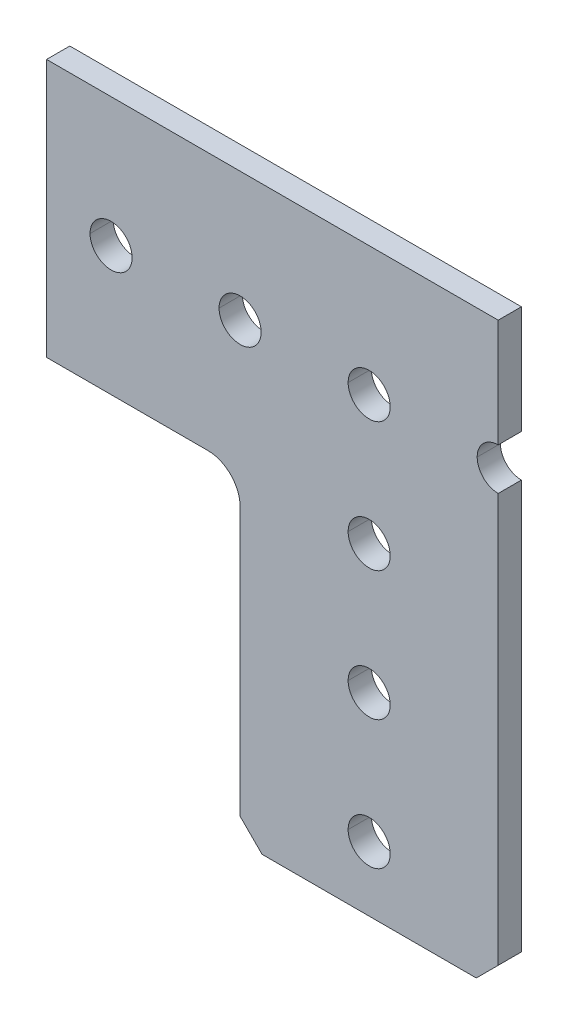
ISO-10303-21;
HEADER;
FILE_DESCRIPTION(('STEP AP214'),'2;1');
FILE_NAME('part.step','',(''),(''),'','','');
FILE_SCHEMA(('AUTOMOTIVE_DESIGN { 1 0 10303 214 1 1 1 1 }'));
ENDSEC;
DATA;
#1=APPLICATION_CONTEXT('core data for automotive mechanical design processes');
#2=APPLICATION_PROTOCOL_DEFINITION('international standard','automotive_design',2000,#1);
#3=PRODUCT_CONTEXT('',#1,'mechanical');
#4=PRODUCT('Part','Part','',(#3));
#5=PRODUCT_RELATED_PRODUCT_CATEGORY('part','',(#4));
#6=PRODUCT_DEFINITION_FORMATION('','',#4);
#7=PRODUCT_DEFINITION_CONTEXT('part definition',#1,'design');
#8=PRODUCT_DEFINITION('design','',#6,#7);
#9=PRODUCT_DEFINITION_SHAPE('','',#8);
#10=(LENGTH_UNIT() NAMED_UNIT(*) SI_UNIT(.MILLI.,.METRE.));
#11=(NAMED_UNIT(*) PLANE_ANGLE_UNIT() SI_UNIT($,.RADIAN.));
#12=(NAMED_UNIT(*) SI_UNIT($,.STERADIAN.) SOLID_ANGLE_UNIT());
#13=UNCERTAINTY_MEASURE_WITH_UNIT(LENGTH_MEASURE(1.E-05),#10,'distance_accuracy_value','');
#14=(GEOMETRIC_REPRESENTATION_CONTEXT(3) GLOBAL_UNCERTAINTY_ASSIGNED_CONTEXT((#13)) GLOBAL_UNIT_ASSIGNED_CONTEXT((#10,
#11,#12)) REPRESENTATION_CONTEXT('',''));
#15=CARTESIAN_POINT('',(0.,0.,0.));
#16=DIRECTION('',(0.,0.,1.));
#17=DIRECTION('',(1.,0.,0.));
#18=AXIS2_PLACEMENT_3D('',#15,#16,#17);
#19=CARTESIAN_POINT('',(0.,-12.7,2.286));
#20=DIRECTION('',(0.,0.,-1.));
#21=DIRECTION('',(-1.,0.,0.));
#22=AXIS2_PLACEMENT_3D('',#19,#20,#21);
#23=CYLINDRICAL_SURFACE('',#22,2.0701);
#24=CARTESIAN_POINT('',(0.,-12.7,2.286));
#25=DIRECTION('',(0.,0.,1.));
#26=DIRECTION('',(1.,0.,0.));
#27=AXIS2_PLACEMENT_3D('',#24,#25,#26);
#28=CIRCLE('',#27,2.0701);
#29=CARTESIAN_POINT('',(-2.0701,-12.7,2.286));
#30=VERTEX_POINT('',#29);
#31=CARTESIAN_POINT('',(2.0701,-12.7,2.286));
#32=VERTEX_POINT('',#31);
#33=EDGE_CURVE('E11',#30,#32,#28,.T.);
#34=ORIENTED_EDGE('',*,*,#33,.T.);
#35=DIRECTION('',(0.,0.,-1.));
#36=VECTOR('',#35,1.);
#37=CARTESIAN_POINT('',(2.0701,-12.7,2.286));
#38=LINE('',#37,#36);
#39=CARTESIAN_POINT('',(2.0701,-12.7,0.));
#40=VERTEX_POINT('',#39);
#41=EDGE_CURVE('E52',#32,#40,#38,.T.);
#42=ORIENTED_EDGE('',*,*,#41,.T.);
#43=CARTESIAN_POINT('',(0.,-12.7,0.));
#44=DIRECTION('',(0.,0.,1.));
#45=DIRECTION('',(1.,0.,0.));
#46=AXIS2_PLACEMENT_3D('',#43,#44,#45);
#47=CIRCLE('',#46,2.0701);
#48=CARTESIAN_POINT('',(-2.0701,-12.7,0.));
#49=VERTEX_POINT('',#48);
#50=EDGE_CURVE('E270',#49,#40,#47,.T.);
#51=ORIENTED_EDGE('',*,*,#50,.F.);
#52=DIRECTION('',(0.,0.,-1.));
#53=VECTOR('',#52,1.);
#54=CARTESIAN_POINT('',(-2.0701,-12.7,2.286));
#55=LINE('',#54,#53);
#56=EDGE_CURVE('E418',#30,#49,#55,.T.);
#57=ORIENTED_EDGE('',*,*,#56,.F.);
#58=EDGE_LOOP('',(#34,#42,#51,#57));
#59=FACE_BOUND('',#58,.T.);
#60=ADVANCED_FACE('F42',(#59),#23,.F.);
#61=CARTESIAN_POINT('',(0.,0.,2.286));
#62=DIRECTION('',(0.,0.,-1.));
#63=DIRECTION('',(-1.,0.,0.));
#64=AXIS2_PLACEMENT_3D('',#61,#62,#63);
#65=CYLINDRICAL_SURFACE('',#64,2.0701);
#66=CARTESIAN_POINT('',(0.,0.,2.286));
#67=DIRECTION('',(0.,0.,1.));
#68=DIRECTION('',(1.,0.,0.));
#69=AXIS2_PLACEMENT_3D('',#66,#67,#68);
#70=CIRCLE('',#69,2.0701);
#71=CARTESIAN_POINT('',(-2.0701,0.,2.286));
#72=VERTEX_POINT('',#71);
#73=CARTESIAN_POINT('',(2.0701,0.,2.286));
#74=VERTEX_POINT('',#73);
#75=EDGE_CURVE('E427',#72,#74,#70,.T.);
#76=ORIENTED_EDGE('',*,*,#75,.T.);
#77=DIRECTION('',(0.,0.,-1.));
#78=VECTOR('',#77,1.);
#79=CARTESIAN_POINT('',(2.0701,0.,2.286));
#80=LINE('',#79,#78);
#81=CARTESIAN_POINT('',(2.0701,0.,0.));
#82=VERTEX_POINT('',#81);
#83=EDGE_CURVE('E276',#74,#82,#80,.T.);
#84=ORIENTED_EDGE('',*,*,#83,.T.);
#85=CARTESIAN_POINT('',(0.,0.,0.));
#86=DIRECTION('',(0.,0.,1.));
#87=DIRECTION('',(1.,0.,0.));
#88=AXIS2_PLACEMENT_3D('',#85,#86,#87);
#89=CIRCLE('',#88,2.0701);
#90=CARTESIAN_POINT('',(-2.0701,0.,0.));
#91=VERTEX_POINT('',#90);
#92=EDGE_CURVE('E293',#91,#82,#89,.T.);
#93=ORIENTED_EDGE('',*,*,#92,.F.);
#94=DIRECTION('',(0.,0.,-1.));
#95=VECTOR('',#94,1.);
#96=CARTESIAN_POINT('',(-2.0701,0.,2.286));
#97=LINE('',#96,#95);
#98=EDGE_CURVE('E417',#72,#91,#97,.T.);
#99=ORIENTED_EDGE('',*,*,#98,.F.);
#100=EDGE_LOOP('',(#76,#84,#93,#99));
#101=FACE_BOUND('',#100,.T.);
#102=ADVANCED_FACE('F528',(#101),#65,.F.);
#103=CARTESIAN_POINT('',(12.7,12.7,2.286));
#104=DIRECTION('',(0.,0.,-1.));
#105=DIRECTION('',(-1.,0.,0.));
#106=AXIS2_PLACEMENT_3D('',#103,#104,#105);
#107=CYLINDRICAL_SURFACE('',#106,2.0701);
#108=CARTESIAN_POINT('',(12.7,12.7,2.286));
#109=DIRECTION('',(0.,0.,1.));
#110=DIRECTION('',(1.,0.,0.));
#111=AXIS2_PLACEMENT_3D('',#108,#109,#110);
#112=CIRCLE('',#111,2.0701);
#113=CARTESIAN_POINT('',(10.6299,12.7,2.286));
#114=VERTEX_POINT('',#113);
#115=CARTESIAN_POINT('',(12.7,10.6299,2.286));
#116=VERTEX_POINT('',#115);
#117=EDGE_CURVE('E332',#114,#116,#112,.T.);
#118=ORIENTED_EDGE('',*,*,#117,.T.);
#119=DIRECTION('',(0.,0.,-1.));
#120=VECTOR('',#119,1.);
#121=CARTESIAN_POINT('',(12.7,10.6299,2.286));
#122=LINE('',#121,#120);
#123=CARTESIAN_POINT('',(12.7,10.6299,0.));
#124=VERTEX_POINT('',#123);
#125=EDGE_CURVE('E454',#116,#124,#122,.T.);
#126=ORIENTED_EDGE('',*,*,#125,.T.);
#127=CARTESIAN_POINT('',(12.7,12.7,0.));
#128=DIRECTION('',(0.,0.,1.));
#129=DIRECTION('',(1.,0.,0.));
#130=AXIS2_PLACEMENT_3D('',#127,#128,#129);
#131=CIRCLE('',#130,2.0701);
#132=CARTESIAN_POINT('',(10.6299,12.7,0.));
#133=VERTEX_POINT('',#132);
#134=EDGE_CURVE('E308',#133,#124,#131,.T.);
#135=ORIENTED_EDGE('',*,*,#134,.F.);
#136=DIRECTION('',(0.,0.,-1.));
#137=VECTOR('',#136,1.);
#138=CARTESIAN_POINT('',(10.6299,12.7,2.286));
#139=LINE('',#138,#137);
#140=EDGE_CURVE('E322',#114,#133,#139,.T.);
#141=ORIENTED_EDGE('',*,*,#140,.F.);
#142=EDGE_LOOP('',(#118,#126,#135,#141));
#143=FACE_BOUND('',#142,.T.);
#144=ADVANCED_FACE('F534',(#143),#107,.F.);
#145=CARTESIAN_POINT('',(0.,12.7,2.286));
#146=DIRECTION('',(0.,0.,-1.));
#147=DIRECTION('',(-1.,0.,0.));
#148=AXIS2_PLACEMENT_3D('',#145,#146,#147);
#149=CYLINDRICAL_SURFACE('',#148,2.0701);
#150=CARTESIAN_POINT('',(0.,12.7,2.286));
#151=DIRECTION('',(0.,0.,1.));
#152=DIRECTION('',(1.,0.,0.));
#153=AXIS2_PLACEMENT_3D('',#150,#151,#152);
#154=CIRCLE('',#153,2.0701);
#155=CARTESIAN_POINT('',(-2.0701,12.7,2.286));
#156=VERTEX_POINT('',#155);
#157=CARTESIAN_POINT('',(2.0701,12.7,2.286));
#158=VERTEX_POINT('',#157);
#159=EDGE_CURVE('E328',#156,#158,#154,.T.);
#160=ORIENTED_EDGE('',*,*,#159,.T.);
#161=DIRECTION('',(0.,0.,-1.));
#162=VECTOR('',#161,1.);
#163=CARTESIAN_POINT('',(2.0701,12.7,2.286));
#164=LINE('',#163,#162);
#165=CARTESIAN_POINT('',(2.0701,12.7,0.));
#166=VERTEX_POINT('',#165);
#167=EDGE_CURVE('E333',#158,#166,#164,.T.);
#168=ORIENTED_EDGE('',*,*,#167,.T.);
#169=CARTESIAN_POINT('',(0.,12.7,0.));
#170=DIRECTION('',(0.,0.,1.));
#171=DIRECTION('',(1.,0.,0.));
#172=AXIS2_PLACEMENT_3D('',#169,#170,#171);
#173=CIRCLE('',#172,2.0701);
#174=CARTESIAN_POINT('',(-2.0701,12.7,0.));
#175=VERTEX_POINT('',#174);
#176=EDGE_CURVE('E318',#175,#166,#173,.T.);
#177=ORIENTED_EDGE('',*,*,#176,.F.);
#178=DIRECTION('',(0.,0.,-1.));
#179=VECTOR('',#178,1.);
#180=CARTESIAN_POINT('',(-2.0701,12.7,2.286));
#181=LINE('',#180,#179);
#182=EDGE_CURVE('E409',#156,#175,#181,.T.);
#183=ORIENTED_EDGE('',*,*,#182,.F.);
#184=EDGE_LOOP('',(#160,#168,#177,#183));
#185=FACE_BOUND('',#184,.T.);
#186=ADVANCED_FACE('F549',(#185),#149,.F.);
#187=CARTESIAN_POINT('',(-12.7,12.7,2.286));
#188=DIRECTION('',(0.,0.,-1.));
#189=DIRECTION('',(-1.,0.,0.));
#190=AXIS2_PLACEMENT_3D('',#187,#188,#189);
#191=CYLINDRICAL_SURFACE('',#190,2.0701);
#192=CARTESIAN_POINT('',(-12.7,12.7,2.286));
#193=DIRECTION('',(0.,0.,1.));
#194=DIRECTION('',(1.,0.,0.));
#195=AXIS2_PLACEMENT_3D('',#192,#193,#194);
#196=CIRCLE('',#195,2.0701);
#197=CARTESIAN_POINT('',(-14.7701,12.7,2.286));
#198=VERTEX_POINT('',#197);
#199=CARTESIAN_POINT('',(-10.6299,12.7,2.286));
#200=VERTEX_POINT('',#199);
#201=EDGE_CURVE('E381',#198,#200,#196,.T.);
#202=ORIENTED_EDGE('',*,*,#201,.T.);
#203=DIRECTION('',(0.,0.,-1.));
#204=VECTOR('',#203,1.);
#205=CARTESIAN_POINT('',(-10.6299,12.7,2.286));
#206=LINE('',#205,#204);
#207=CARTESIAN_POINT('',(-10.6299,12.7,0.));
#208=VERTEX_POINT('',#207);
#209=EDGE_CURVE('E378',#200,#208,#206,.T.);
#210=ORIENTED_EDGE('',*,*,#209,.T.);
#211=CARTESIAN_POINT('',(-12.7,12.7,0.));
#212=DIRECTION('',(0.,0.,1.));
#213=DIRECTION('',(1.,0.,0.));
#214=AXIS2_PLACEMENT_3D('',#211,#212,#213);
#215=CIRCLE('',#214,2.0701);
#216=CARTESIAN_POINT('',(-14.7701,12.7,0.));
#217=VERTEX_POINT('',#216);
#218=EDGE_CURVE('E307',#217,#208,#215,.T.);
#219=ORIENTED_EDGE('',*,*,#218,.F.);
#220=DIRECTION('',(0.,0.,-1.));
#221=VECTOR('',#220,1.);
#222=CARTESIAN_POINT('',(-14.7701,12.7,2.286));
#223=LINE('',#222,#221);
#224=EDGE_CURVE('E344',#198,#217,#223,.T.);
#225=ORIENTED_EDGE('',*,*,#224,.F.);
#226=EDGE_LOOP('',(#202,#210,#219,#225));
#227=FACE_BOUND('',#226,.T.);
#228=ADVANCED_FACE('F546',(#227),#191,.F.);
#229=CARTESIAN_POINT('',(0.,-25.4,2.286));
#230=DIRECTION('',(0.,0.,-1.));
#231=DIRECTION('',(-1.,0.,0.));
#232=AXIS2_PLACEMENT_3D('',#229,#230,#231);
#233=CYLINDRICAL_SURFACE('',#232,2.0701);
#234=CARTESIAN_POINT('',(0.,-25.4,2.286));
#235=DIRECTION('',(0.,0.,1.));
#236=DIRECTION('',(1.,0.,0.));
#237=AXIS2_PLACEMENT_3D('',#234,#235,#236);
#238=CIRCLE('',#237,2.0701);
#239=CARTESIAN_POINT('',(-2.0701,-25.4,2.286));
#240=VERTEX_POINT('',#239);
#241=CARTESIAN_POINT('',(2.0701,-25.4,2.286));
#242=VERTEX_POINT('',#241);
#243=EDGE_CURVE('E287',#240,#242,#238,.T.);
#244=ORIENTED_EDGE('',*,*,#243,.T.);
#245=DIRECTION('',(0.,0.,-1.));
#246=VECTOR('',#245,1.);
#247=CARTESIAN_POINT('',(2.0701,-25.4,2.286));
#248=LINE('',#247,#246);
#249=CARTESIAN_POINT('',(2.0701,-25.4,0.));
#250=VERTEX_POINT('',#249);
#251=EDGE_CURVE('E283',#242,#250,#248,.T.);
#252=ORIENTED_EDGE('',*,*,#251,.T.);
#253=CARTESIAN_POINT('',(0.,-25.4,0.));
#254=DIRECTION('',(0.,0.,1.));
#255=DIRECTION('',(1.,0.,0.));
#256=AXIS2_PLACEMENT_3D('',#253,#254,#255);
#257=CIRCLE('',#256,2.0701);
#258=CARTESIAN_POINT('',(-2.0701,-25.4,0.));
#259=VERTEX_POINT('',#258);
#260=EDGE_CURVE('E297',#259,#250,#257,.T.);
#261=ORIENTED_EDGE('',*,*,#260,.F.);
#262=DIRECTION('',(0.,0.,-1.));
#263=VECTOR('',#262,1.);
#264=CARTESIAN_POINT('',(-2.0701,-25.4,2.286));
#265=LINE('',#264,#263);
#266=EDGE_CURVE('E343',#240,#259,#265,.T.);
#267=ORIENTED_EDGE('',*,*,#266,.F.);
#268=EDGE_LOOP('',(#244,#252,#261,#267));
#269=FACE_BOUND('',#268,.T.);
#270=ADVANCED_FACE('F548',(#269),#233,.F.);
#271=CARTESIAN_POINT('',(-25.4,12.7,2.286));
#272=DIRECTION('',(0.,0.,-1.));
#273=DIRECTION('',(-1.,0.,0.));
#274=AXIS2_PLACEMENT_3D('',#271,#272,#273);
#275=CYLINDRICAL_SURFACE('',#274,2.0701);
#276=CARTESIAN_POINT('',(-25.4,12.7,2.286));
#277=DIRECTION('',(0.,0.,1.));
#278=DIRECTION('',(1.,0.,0.));
#279=AXIS2_PLACEMENT_3D('',#276,#277,#278);
#280=CIRCLE('',#279,2.0701);
#281=CARTESIAN_POINT('',(-27.4701,12.7,2.286));
#282=VERTEX_POINT('',#281);
#283=CARTESIAN_POINT('',(-23.3299,12.7,2.286));
#284=VERTEX_POINT('',#283);
#285=EDGE_CURVE('E288',#282,#284,#280,.T.);
#286=ORIENTED_EDGE('',*,*,#285,.T.);
#287=DIRECTION('',(0.,0.,-1.));
#288=VECTOR('',#287,1.);
#289=CARTESIAN_POINT('',(-23.3299,12.7,2.286));
#290=LINE('',#289,#288);
#291=CARTESIAN_POINT('',(-23.3299,12.7,0.));
#292=VERTEX_POINT('',#291);
#293=EDGE_CURVE('E392',#284,#292,#290,.T.);
#294=ORIENTED_EDGE('',*,*,#293,.T.);
#295=CARTESIAN_POINT('',(-25.4,12.7,0.));
#296=DIRECTION('',(0.,0.,1.));
#297=DIRECTION('',(1.,0.,0.));
#298=AXIS2_PLACEMENT_3D('',#295,#296,#297);
#299=CIRCLE('',#298,2.0701);
#300=CARTESIAN_POINT('',(-27.4701,12.7,0.));
#301=VERTEX_POINT('',#300);
#302=EDGE_CURVE('E278',#301,#292,#299,.T.);
#303=ORIENTED_EDGE('',*,*,#302,.F.);
#304=DIRECTION('',(0.,0.,-1.));
#305=VECTOR('',#304,1.);
#306=CARTESIAN_POINT('',(-27.4701,12.7,2.286));
#307=LINE('',#306,#305);
#308=EDGE_CURVE('E358',#282,#301,#307,.T.);
#309=ORIENTED_EDGE('',*,*,#308,.F.);
#310=EDGE_LOOP('',(#286,#294,#303,#309));
#311=FACE_BOUND('',#310,.T.);
#312=ADVANCED_FACE('F595',(#311),#275,.F.);
#313=CARTESIAN_POINT('',(-44.45,0.,2.286));
#314=DIRECTION('',(0.,0.,1.));
#315=DIRECTION('',(1.,0.,0.));
#316=AXIS2_PLACEMENT_3D('',#313,#314,#315);
#317=PLANE('',#316);
#318=DIRECTION('',(0.,1.,0.));
#319=VECTOR('',#318,1.);
#320=CARTESIAN_POINT('',(-31.75,25.4,2.286));
#321=LINE('',#320,#319);
#322=CARTESIAN_POINT('',(-31.75,0.,2.286));
#323=VERTEX_POINT('',#322);
#324=CARTESIAN_POINT('',(-31.75,25.4,2.286));
#325=VERTEX_POINT('',#324);
#326=EDGE_CURVE('E245',#323,#325,#321,.T.);
#327=ORIENTED_EDGE('',*,*,#326,.F.);
#328=DIRECTION('',(1.,0.,0.));
#329=VECTOR('',#328,1.);
#330=CARTESIAN_POINT('',(-44.45,0.,2.286));
#331=LINE('',#330,#329);
#332=CARTESIAN_POINT('',(-15.875,0.,2.286));
#333=VERTEX_POINT('',#332);
#334=EDGE_CURVE('E317',#323,#333,#331,.T.);
#335=ORIENTED_EDGE('',*,*,#334,.T.);
#336=CARTESIAN_POINT('',(-15.875,-3.175,2.286));
#337=DIRECTION('',(0.,0.,-1.));
#338=DIRECTION('',(1.,0.,0.));
#339=AXIS2_PLACEMENT_3D('',#336,#337,#338);
#340=CIRCLE('',#339,3.175);
#341=CARTESIAN_POINT('',(-12.7,-3.175,2.286));
#342=VERTEX_POINT('',#341);
#343=EDGE_CURVE('E334',#333,#342,#340,.T.);
#344=ORIENTED_EDGE('',*,*,#343,.T.);
#345=DIRECTION('',(0.,-1.,0.));
#346=VECTOR('',#345,1.);
#347=CARTESIAN_POINT('',(-12.7,0.,2.286));
#348=LINE('',#347,#346);
#349=CARTESIAN_POINT('',(-12.7,-29.591,2.286));
#350=VERTEX_POINT('',#349);
#351=EDGE_CURVE('E338',#342,#350,#348,.T.);
#352=ORIENTED_EDGE('',*,*,#351,.T.);
#353=DIRECTION('',(0.707106781186547,-0.707106781186548,0.));
#354=VECTOR('',#353,1.);
#355=CARTESIAN_POINT('',(-43.3705,1.0795,2.286));
#356=LINE('',#355,#354);
#357=CARTESIAN_POINT('',(-10.541,-31.75,2.286));
#358=VERTEX_POINT('',#357);
#359=EDGE_CURVE('E302',#350,#358,#356,.T.);
#360=ORIENTED_EDGE('',*,*,#359,.T.);
#361=DIRECTION('',(1.,0.,0.));
#362=VECTOR('',#361,1.);
#363=CARTESIAN_POINT('',(-12.7,-31.75,2.286));
#364=LINE('',#363,#362);
#365=CARTESIAN_POINT('',(10.541,-31.75,2.286));
#366=VERTEX_POINT('',#365);
#367=EDGE_CURVE('E349',#358,#366,#364,.T.);
#368=ORIENTED_EDGE('',*,*,#367,.T.);
#369=DIRECTION('',(0.707106781186547,0.707106781186548,0.));
#370=VECTOR('',#369,1.);
#371=CARTESIAN_POINT('',(-1.07949999999996,-43.3705,2.286));
#372=LINE('',#371,#370);
#373=CARTESIAN_POINT('',(12.7,-29.591,2.286));
#374=VERTEX_POINT('',#373);
#375=EDGE_CURVE('E345',#366,#374,#372,.T.);
#376=ORIENTED_EDGE('',*,*,#375,.T.);
#377=DIRECTION('',(0.,1.,0.));
#378=VECTOR('',#377,1.);
#379=CARTESIAN_POINT('',(12.7,0.,2.286));
#380=LINE('',#379,#378);
#381=EDGE_CURVE('E316',#374,#116,#380,.T.);
#382=ORIENTED_EDGE('',*,*,#381,.T.);
#383=ORIENTED_EDGE('',*,*,#117,.F.);
#384=CARTESIAN_POINT('',(12.7,12.7,2.286));
#385=DIRECTION('',(0.,0.,1.));
#386=DIRECTION('',(1.,0.,0.));
#387=AXIS2_PLACEMENT_3D('',#384,#385,#386);
#388=CIRCLE('',#387,2.0701);
#389=CARTESIAN_POINT('',(12.7,14.7701,2.286));
#390=VERTEX_POINT('',#389);
#391=EDGE_CURVE('E326',#390,#114,#388,.T.);
#392=ORIENTED_EDGE('',*,*,#391,.F.);
#393=DIRECTION('',(0.,-1.,0.));
#394=VECTOR('',#393,1.);
#395=CARTESIAN_POINT('',(12.7,25.4,2.286));
#396=LINE('',#395,#394);
#397=CARTESIAN_POINT('',(12.7,25.4,2.286));
#398=VERTEX_POINT('',#397);
#399=EDGE_CURVE('E68',#398,#390,#396,.T.);
#400=ORIENTED_EDGE('',*,*,#399,.F.);
#401=DIRECTION('',(-1.,0.,0.));
#402=VECTOR('',#401,1.);
#403=CARTESIAN_POINT('',(-44.45,25.4,2.286));
#404=LINE('',#403,#402);
#405=EDGE_CURVE('E314',#398,#325,#404,.T.);
#406=ORIENTED_EDGE('',*,*,#405,.T.);
#407=EDGE_LOOP('',(#327,#335,#344,#352,#360,#368,#376,#382,#383,#392,#400,#406));
#408=FACE_BOUND('',#407,.T.);
#409=ORIENTED_EDGE('',*,*,#75,.F.);
#410=CARTESIAN_POINT('',(0.,0.,2.286));
#411=DIRECTION('',(0.,0.,1.));
#412=DIRECTION('',(1.,0.,0.));
#413=AXIS2_PLACEMENT_3D('',#410,#411,#412);
#414=CIRCLE('',#413,2.0701);
#415=EDGE_CURVE('E327',#74,#72,#414,.T.);
#416=ORIENTED_EDGE('',*,*,#415,.F.);
#417=EDGE_LOOP('',(#409,#416));
#418=FACE_BOUND('',#417,.T.);
#419=ORIENTED_EDGE('',*,*,#159,.F.);
#420=CARTESIAN_POINT('',(0.,12.7,2.286));
#421=DIRECTION('',(0.,0.,1.));
#422=DIRECTION('',(1.,0.,0.));
#423=AXIS2_PLACEMENT_3D('',#420,#421,#422);
#424=CIRCLE('',#423,2.0701);
#425=EDGE_CURVE('E389',#158,#156,#424,.T.);
#426=ORIENTED_EDGE('',*,*,#425,.F.);
#427=EDGE_LOOP('',(#419,#426));
#428=FACE_BOUND('',#427,.T.);
#429=ORIENTED_EDGE('',*,*,#243,.F.);
#430=CARTESIAN_POINT('',(0.,-25.4,2.286));
#431=DIRECTION('',(0.,0.,1.));
#432=DIRECTION('',(1.,0.,0.));
#433=AXIS2_PLACEMENT_3D('',#430,#431,#432);
#434=CIRCLE('',#433,2.0701);
#435=EDGE_CURVE('E354',#242,#240,#434,.T.);
#436=ORIENTED_EDGE('',*,*,#435,.F.);
#437=EDGE_LOOP('',(#429,#436));
#438=FACE_BOUND('',#437,.T.);
#439=ORIENTED_EDGE('',*,*,#285,.F.);
#440=CARTESIAN_POINT('',(-25.4,12.7,2.286));
#441=DIRECTION('',(0.,0.,1.));
#442=DIRECTION('',(1.,0.,0.));
#443=AXIS2_PLACEMENT_3D('',#440,#441,#442);
#444=CIRCLE('',#443,2.0701);
#445=EDGE_CURVE('E434',#284,#282,#444,.T.);
#446=ORIENTED_EDGE('',*,*,#445,.F.);
#447=EDGE_LOOP('',(#439,#446));
#448=FACE_BOUND('',#447,.T.);
#449=ORIENTED_EDGE('',*,*,#201,.F.);
#450=CARTESIAN_POINT('',(-12.7,12.7,2.286));
#451=DIRECTION('',(0.,0.,1.));
#452=DIRECTION('',(1.,0.,0.));
#453=AXIS2_PLACEMENT_3D('',#450,#451,#452);
#454=CIRCLE('',#453,2.0701);
#455=EDGE_CURVE('E339',#200,#198,#454,.T.);
#456=ORIENTED_EDGE('',*,*,#455,.F.);
#457=EDGE_LOOP('',(#449,#456));
#458=FACE_BOUND('',#457,.T.);
#459=ORIENTED_EDGE('',*,*,#33,.F.);
#460=CARTESIAN_POINT('',(0.,-12.7,2.286));
#461=DIRECTION('',(0.,0.,1.));
#462=DIRECTION('',(1.,0.,0.));
#463=AXIS2_PLACEMENT_3D('',#460,#461,#462);
#464=CIRCLE('',#463,2.0701);
#465=EDGE_CURVE('E413',#32,#30,#464,.T.);
#466=ORIENTED_EDGE('',*,*,#465,.F.);
#467=EDGE_LOOP('',(#459,#466));
#468=FACE_BOUND('',#467,.T.);
#469=ADVANCED_FACE('F501',(#408,#418,#428,#438,#448,#458,#468),#317,.T.);
#470=CARTESIAN_POINT('',(-44.45,0.,0.));
#471=DIRECTION('',(0.,0.,1.));
#472=DIRECTION('',(1.,0.,0.));
#473=AXIS2_PLACEMENT_3D('',#470,#471,#472);
#474=PLANE('',#473);
#475=ORIENTED_EDGE('',*,*,#92,.T.);
#476=CARTESIAN_POINT('',(0.,0.,0.));
#477=DIRECTION('',(0.,0.,1.));
#478=DIRECTION('',(1.,0.,0.));
#479=AXIS2_PLACEMENT_3D('',#476,#477,#478);
#480=CIRCLE('',#479,2.0701);
#481=EDGE_CURVE('E46',#82,#91,#480,.T.);
#482=ORIENTED_EDGE('',*,*,#481,.T.);
#483=EDGE_LOOP('',(#475,#482));
#484=FACE_BOUND('',#483,.T.);
#485=ORIENTED_EDGE('',*,*,#176,.T.);
#486=CARTESIAN_POINT('',(0.,12.7,0.));
#487=DIRECTION('',(0.,0.,1.));
#488=DIRECTION('',(1.,0.,0.));
#489=AXIS2_PLACEMENT_3D('',#486,#487,#488);
#490=CIRCLE('',#489,2.0701);
#491=EDGE_CURVE('E321',#166,#175,#490,.T.);
#492=ORIENTED_EDGE('',*,*,#491,.T.);
#493=EDGE_LOOP('',(#485,#492));
#494=FACE_BOUND('',#493,.T.);
#495=ORIENTED_EDGE('',*,*,#260,.T.);
#496=CARTESIAN_POINT('',(0.,-25.4,0.));
#497=DIRECTION('',(0.,0.,1.));
#498=DIRECTION('',(1.,0.,0.));
#499=AXIS2_PLACEMENT_3D('',#496,#497,#498);
#500=CIRCLE('',#499,2.0701);
#501=EDGE_CURVE('E280',#250,#259,#500,.T.);
#502=ORIENTED_EDGE('',*,*,#501,.T.);
#503=EDGE_LOOP('',(#495,#502));
#504=FACE_BOUND('',#503,.T.);
#505=ORIENTED_EDGE('',*,*,#302,.T.);
#506=CARTESIAN_POINT('',(-25.4,12.7,0.));
#507=DIRECTION('',(0.,0.,1.));
#508=DIRECTION('',(1.,0.,0.));
#509=AXIS2_PLACEMENT_3D('',#506,#507,#508);
#510=CIRCLE('',#509,2.0701);
#511=EDGE_CURVE('E281',#292,#301,#510,.T.);
#512=ORIENTED_EDGE('',*,*,#511,.T.);
#513=EDGE_LOOP('',(#505,#512));
#514=FACE_BOUND('',#513,.T.);
#515=ORIENTED_EDGE('',*,*,#218,.T.);
#516=CARTESIAN_POINT('',(-12.7,12.7,0.));
#517=DIRECTION('',(0.,0.,1.));
#518=DIRECTION('',(1.,0.,0.));
#519=AXIS2_PLACEMENT_3D('',#516,#517,#518);
#520=CIRCLE('',#519,2.0701);
#521=EDGE_CURVE('E303',#208,#217,#520,.T.);
#522=ORIENTED_EDGE('',*,*,#521,.T.);
#523=EDGE_LOOP('',(#515,#522));
#524=FACE_BOUND('',#523,.T.);
#525=DIRECTION('',(1.,0.,0.));
#526=VECTOR('',#525,1.);
#527=CARTESIAN_POINT('',(-44.45,0.,0.));
#528=LINE('',#527,#526);
#529=CARTESIAN_POINT('',(-31.75,0.,0.));
#530=VERTEX_POINT('',#529);
#531=CARTESIAN_POINT('',(-15.875,0.,0.));
#532=VERTEX_POINT('',#531);
#533=EDGE_CURVE('E261',#530,#532,#528,.T.);
#534=ORIENTED_EDGE('',*,*,#533,.F.);
#535=DIRECTION('',(0.,1.,0.));
#536=VECTOR('',#535,1.);
#537=CARTESIAN_POINT('',(-31.75,25.4,0.));
#538=LINE('',#537,#536);
#539=CARTESIAN_POINT('',(-31.75,25.4,0.));
#540=VERTEX_POINT('',#539);
#541=EDGE_CURVE('E60',#530,#540,#538,.T.);
#542=ORIENTED_EDGE('',*,*,#541,.T.);
#543=DIRECTION('',(-1.,0.,0.));
#544=VECTOR('',#543,1.);
#545=CARTESIAN_POINT('',(-44.45,25.4,0.));
#546=LINE('',#545,#544);
#547=CARTESIAN_POINT('',(12.7,25.4,0.));
#548=VERTEX_POINT('',#547);
#549=EDGE_CURVE('E259',#548,#540,#546,.T.);
#550=ORIENTED_EDGE('',*,*,#549,.F.);
#551=DIRECTION('',(0.,-1.,0.));
#552=VECTOR('',#551,1.);
#553=CARTESIAN_POINT('',(12.7,25.4,0.));
#554=LINE('',#553,#552);
#555=CARTESIAN_POINT('',(12.7,14.7701,0.));
#556=VERTEX_POINT('',#555);
#557=EDGE_CURVE('E494',#548,#556,#554,.T.);
#558=ORIENTED_EDGE('',*,*,#557,.T.);
#559=CARTESIAN_POINT('',(12.7,12.7,0.));
#560=DIRECTION('',(0.,0.,1.));
#561=DIRECTION('',(1.,0.,0.));
#562=AXIS2_PLACEMENT_3D('',#559,#560,#561);
#563=CIRCLE('',#562,2.0701);
#564=EDGE_CURVE('E374',#556,#133,#563,.T.);
#565=ORIENTED_EDGE('',*,*,#564,.T.);
#566=ORIENTED_EDGE('',*,*,#134,.T.);
#567=DIRECTION('',(0.,1.,0.));
#568=VECTOR('',#567,1.);
#569=CARTESIAN_POINT('',(12.7,0.,0.));
#570=LINE('',#569,#568);
#571=CARTESIAN_POINT('',(12.7,-29.591,0.));
#572=VERTEX_POINT('',#571);
#573=EDGE_CURVE('E363',#572,#124,#570,.T.);
#574=ORIENTED_EDGE('',*,*,#573,.F.);
#575=DIRECTION('',(-0.707106781186547,-0.707106781186548,0.));
#576=VECTOR('',#575,1.);
#577=CARTESIAN_POINT('',(12.7,-29.591,0.));
#578=LINE('',#577,#576);
#579=CARTESIAN_POINT('',(10.541,-31.75,0.));
#580=VERTEX_POINT('',#579);
#581=EDGE_CURVE('E298',#572,#580,#578,.T.);
#582=ORIENTED_EDGE('',*,*,#581,.T.);
#583=DIRECTION('',(1.,0.,0.));
#584=VECTOR('',#583,1.);
#585=CARTESIAN_POINT('',(-12.7,-31.75,0.));
#586=LINE('',#585,#584);
#587=CARTESIAN_POINT('',(-10.541,-31.75,0.));
#588=VERTEX_POINT('',#587);
#589=EDGE_CURVE('E309',#588,#580,#586,.T.);
#590=ORIENTED_EDGE('',*,*,#589,.F.);
#591=DIRECTION('',(-0.707106781186547,0.707106781186548,0.));
#592=VECTOR('',#591,1.);
#593=CARTESIAN_POINT('',(-10.541,-31.75,0.));
#594=LINE('',#593,#592);
#595=CARTESIAN_POINT('',(-12.7,-29.591,0.));
#596=VERTEX_POINT('',#595);
#597=EDGE_CURVE('E292',#588,#596,#594,.T.);
#598=ORIENTED_EDGE('',*,*,#597,.T.);
#599=DIRECTION('',(0.,-1.,0.));
#600=VECTOR('',#599,1.);
#601=CARTESIAN_POINT('',(-12.7,0.,0.));
#602=LINE('',#601,#600);
#603=CARTESIAN_POINT('',(-12.7,-3.175,0.));
#604=VERTEX_POINT('',#603);
#605=EDGE_CURVE('E353',#604,#596,#602,.T.);
#606=ORIENTED_EDGE('',*,*,#605,.F.);
#607=CARTESIAN_POINT('',(-15.875,-3.175,0.));
#608=DIRECTION('',(0.,0.,1.));
#609=DIRECTION('',(1.,0.,0.));
#610=AXIS2_PLACEMENT_3D('',#607,#608,#609);
#611=CIRCLE('',#610,3.175);
#612=EDGE_CURVE('E289',#604,#532,#611,.T.);
#613=ORIENTED_EDGE('',*,*,#612,.T.);
#614=EDGE_LOOP('',(#534,#542,#550,#558,#565,#566,#574,#582,#590,#598,#606,#613));
#615=FACE_BOUND('',#614,.T.);
#616=ORIENTED_EDGE('',*,*,#50,.T.);
#617=CARTESIAN_POINT('',(0.,-12.7,0.));
#618=DIRECTION('',(0.,0.,1.));
#619=DIRECTION('',(1.,0.,0.));
#620=AXIS2_PLACEMENT_3D('',#617,#618,#619);
#621=CIRCLE('',#620,2.0701);
#622=EDGE_CURVE('E266',#40,#49,#621,.T.);
#623=ORIENTED_EDGE('',*,*,#622,.T.);
#624=EDGE_LOOP('',(#616,#623));
#625=FACE_BOUND('',#624,.T.);
#626=ADVANCED_FACE('F256',(#484,#494,#504,#514,#524,#615,#625),#474,.F.);
#627=CARTESIAN_POINT('',(-44.45,25.4,2.286));
#628=DIRECTION('',(0.,-1.,0.));
#629=DIRECTION('',(0.,0.,-1.));
#630=AXIS2_PLACEMENT_3D('',#627,#628,#629);
#631=PLANE('',#630);
#632=ORIENTED_EDGE('',*,*,#549,.T.);
#633=DIRECTION('',(0.,0.,1.));
#634=VECTOR('',#633,1.);
#635=CARTESIAN_POINT('',(-31.75,25.4,0.));
#636=LINE('',#635,#634);
#637=EDGE_CURVE('E242',#540,#325,#636,.T.);
#638=ORIENTED_EDGE('',*,*,#637,.T.);
#639=ORIENTED_EDGE('',*,*,#405,.F.);
#640=DIRECTION('',(0.,0.,1.));
#641=VECTOR('',#640,1.);
#642=CARTESIAN_POINT('',(12.7,25.4,0.));
#643=LINE('',#642,#641);
#644=EDGE_CURVE('E265',#548,#398,#643,.T.);
#645=ORIENTED_EDGE('',*,*,#644,.F.);
#646=EDGE_LOOP('',(#632,#638,#639,#645));
#647=FACE_BOUND('',#646,.T.);
#648=ADVANCED_FACE('F264',(#647),#631,.F.);
#649=CARTESIAN_POINT('',(-44.45,0.,2.286));
#650=DIRECTION('',(0.,1.,0.));
#651=DIRECTION('',(1.,0.,0.));
#652=AXIS2_PLACEMENT_3D('',#649,#650,#651);
#653=PLANE('',#652);
#654=ORIENTED_EDGE('',*,*,#334,.F.);
#655=DIRECTION('',(0.,0.,1.));
#656=VECTOR('',#655,1.);
#657=CARTESIAN_POINT('',(-31.75,0.,0.));
#658=LINE('',#657,#656);
#659=EDGE_CURVE('E251',#530,#323,#658,.T.);
#660=ORIENTED_EDGE('',*,*,#659,.F.);
#661=ORIENTED_EDGE('',*,*,#533,.T.);
#662=DIRECTION('',(0.,0.,1.));
#663=VECTOR('',#662,1.);
#664=CARTESIAN_POINT('',(-15.875,0.,2.286));
#665=LINE('',#664,#663);
#666=EDGE_CURVE('E272',#532,#333,#665,.T.);
#667=ORIENTED_EDGE('',*,*,#666,.T.);
#668=EDGE_LOOP('',(#654,#660,#661,#667));
#669=FACE_BOUND('',#668,.T.);
#670=ADVANCED_FACE('F504',(#669),#653,.F.);
#671=CARTESIAN_POINT('',(-12.7,0.,2.286));
#672=DIRECTION('',(1.,0.,0.));
#673=DIRECTION('',(0.,1.,0.));
#674=AXIS2_PLACEMENT_3D('',#671,#672,#673);
#675=PLANE('',#674);
#676=ORIENTED_EDGE('',*,*,#351,.F.);
#677=DIRECTION('',(0.,0.,-1.));
#678=VECTOR('',#677,1.);
#679=CARTESIAN_POINT('',(-12.7,-3.175,0.));
#680=LINE('',#679,#678);
#681=EDGE_CURVE('E362',#342,#604,#680,.T.);
#682=ORIENTED_EDGE('',*,*,#681,.T.);
#683=ORIENTED_EDGE('',*,*,#605,.T.);
#684=DIRECTION('',(0.,0.,1.));
#685=VECTOR('',#684,1.);
#686=CARTESIAN_POINT('',(-12.7,-29.591,2.286));
#687=LINE('',#686,#685);
#688=EDGE_CURVE('E312',#596,#350,#687,.T.);
#689=ORIENTED_EDGE('',*,*,#688,.T.);
#690=EDGE_LOOP('',(#676,#682,#683,#689));
#691=FACE_BOUND('',#690,.T.);
#692=ADVANCED_FACE('F512',(#691),#675,.F.);
#693=CARTESIAN_POINT('',(-12.7,-31.75,2.286));
#694=DIRECTION('',(0.,1.,0.));
#695=DIRECTION('',(1.,0.,0.));
#696=AXIS2_PLACEMENT_3D('',#693,#694,#695);
#697=PLANE('',#696);
#698=ORIENTED_EDGE('',*,*,#589,.T.);
#699=DIRECTION('',(0.,0.,1.));
#700=VECTOR('',#699,1.);
#701=CARTESIAN_POINT('',(10.541,-31.75,2.286));
#702=LINE('',#701,#700);
#703=EDGE_CURVE('E313',#580,#366,#702,.T.);
#704=ORIENTED_EDGE('',*,*,#703,.T.);
#705=ORIENTED_EDGE('',*,*,#367,.F.);
#706=DIRECTION('',(0.,0.,-1.));
#707=VECTOR('',#706,1.);
#708=CARTESIAN_POINT('',(-10.541,-31.75,2.286));
#709=LINE('',#708,#707);
#710=EDGE_CURVE('E366',#358,#588,#709,.T.);
#711=ORIENTED_EDGE('',*,*,#710,.T.);
#712=EDGE_LOOP('',(#698,#704,#705,#711));
#713=FACE_BOUND('',#712,.T.);
#714=ADVANCED_FACE('F44',(#713),#697,.F.);
#715=CARTESIAN_POINT('',(12.7,0.,2.286));
#716=DIRECTION('',(-1.,0.,0.));
#717=DIRECTION('',(0.,1.,0.));
#718=AXIS2_PLACEMENT_3D('',#715,#716,#717);
#719=PLANE('',#718);
#720=ORIENTED_EDGE('',*,*,#573,.T.);
#721=ORIENTED_EDGE('',*,*,#125,.F.);
#722=ORIENTED_EDGE('',*,*,#381,.F.);
#723=DIRECTION('',(0.,0.,-1.));
#724=VECTOR('',#723,1.);
#725=CARTESIAN_POINT('',(12.7,-29.591,2.286));
#726=LINE('',#725,#724);
#727=EDGE_CURVE('E367',#374,#572,#726,.T.);
#728=ORIENTED_EDGE('',*,*,#727,.T.);
#729=EDGE_LOOP('',(#720,#721,#722,#728));
#730=FACE_BOUND('',#729,.T.);
#731=ADVANCED_FACE('F518',(#730),#719,.F.);
#732=CARTESIAN_POINT('',(-25.4,12.7,2.286));
#733=DIRECTION('',(0.,0.,-1.));
#734=DIRECTION('',(-1.,0.,0.));
#735=AXIS2_PLACEMENT_3D('',#732,#733,#734);
#736=CYLINDRICAL_SURFACE('',#735,2.0701);
#737=ORIENTED_EDGE('',*,*,#293,.F.);
#738=ORIENTED_EDGE('',*,*,#445,.T.);
#739=ORIENTED_EDGE('',*,*,#308,.T.);
#740=ORIENTED_EDGE('',*,*,#511,.F.);
#741=EDGE_LOOP('',(#737,#738,#739,#740));
#742=FACE_BOUND('',#741,.T.);
#743=ADVANCED_FACE('F523',(#742),#736,.F.);
#744=CARTESIAN_POINT('',(0.,-25.4,2.286));
#745=DIRECTION('',(0.,0.,-1.));
#746=DIRECTION('',(-1.,0.,0.));
#747=AXIS2_PLACEMENT_3D('',#744,#745,#746);
#748=CYLINDRICAL_SURFACE('',#747,2.0701);
#749=ORIENTED_EDGE('',*,*,#251,.F.);
#750=ORIENTED_EDGE('',*,*,#435,.T.);
#751=ORIENTED_EDGE('',*,*,#266,.T.);
#752=ORIENTED_EDGE('',*,*,#501,.F.);
#753=EDGE_LOOP('',(#749,#750,#751,#752));
#754=FACE_BOUND('',#753,.T.);
#755=ADVANCED_FACE('F580',(#754),#748,.F.);
#756=CARTESIAN_POINT('',(-12.7,12.7,2.286));
#757=DIRECTION('',(0.,0.,-1.));
#758=DIRECTION('',(-1.,0.,0.));
#759=AXIS2_PLACEMENT_3D('',#756,#757,#758);
#760=CYLINDRICAL_SURFACE('',#759,2.0701);
#761=ORIENTED_EDGE('',*,*,#209,.F.);
#762=ORIENTED_EDGE('',*,*,#455,.T.);
#763=ORIENTED_EDGE('',*,*,#224,.T.);
#764=ORIENTED_EDGE('',*,*,#521,.F.);
#765=EDGE_LOOP('',(#761,#762,#763,#764));
#766=FACE_BOUND('',#765,.T.);
#767=ADVANCED_FACE('F577',(#766),#760,.F.);
#768=CARTESIAN_POINT('',(0.,12.7,2.286));
#769=DIRECTION('',(0.,0.,-1.));
#770=DIRECTION('',(-1.,0.,0.));
#771=AXIS2_PLACEMENT_3D('',#768,#769,#770);
#772=CYLINDRICAL_SURFACE('',#771,2.0701);
#773=ORIENTED_EDGE('',*,*,#167,.F.);
#774=ORIENTED_EDGE('',*,*,#425,.T.);
#775=ORIENTED_EDGE('',*,*,#182,.T.);
#776=ORIENTED_EDGE('',*,*,#491,.F.);
#777=EDGE_LOOP('',(#773,#774,#775,#776));
#778=FACE_BOUND('',#777,.T.);
#779=ADVANCED_FACE('F544',(#778),#772,.F.);
#780=CARTESIAN_POINT('',(12.7,12.7,2.286));
#781=DIRECTION('',(0.,0.,-1.));
#782=DIRECTION('',(-1.,0.,0.));
#783=AXIS2_PLACEMENT_3D('',#780,#781,#782);
#784=CYLINDRICAL_SURFACE('',#783,2.0701);
#785=ORIENTED_EDGE('',*,*,#564,.F.);
#786=DIRECTION('',(0.,0.,-1.));
#787=VECTOR('',#786,1.);
#788=CARTESIAN_POINT('',(12.7,14.7701,2.286));
#789=LINE('',#788,#787);
#790=EDGE_CURVE('E250',#556,#390,#789,.F.);
#791=ORIENTED_EDGE('',*,*,#790,.T.);
#792=ORIENTED_EDGE('',*,*,#391,.T.);
#793=ORIENTED_EDGE('',*,*,#140,.T.);
#794=EDGE_LOOP('',(#785,#791,#792,#793));
#795=FACE_BOUND('',#794,.T.);
#796=ADVANCED_FACE('F540',(#795),#784,.F.);
#797=CARTESIAN_POINT('',(0.,0.,2.286));
#798=DIRECTION('',(0.,0.,-1.));
#799=DIRECTION('',(-1.,0.,0.));
#800=AXIS2_PLACEMENT_3D('',#797,#798,#799);
#801=CYLINDRICAL_SURFACE('',#800,2.0701);
#802=ORIENTED_EDGE('',*,*,#83,.F.);
#803=ORIENTED_EDGE('',*,*,#415,.T.);
#804=ORIENTED_EDGE('',*,*,#98,.T.);
#805=ORIENTED_EDGE('',*,*,#481,.F.);
#806=EDGE_LOOP('',(#802,#803,#804,#805));
#807=FACE_BOUND('',#806,.T.);
#808=ADVANCED_FACE('F543',(#807),#801,.F.);
#809=CARTESIAN_POINT('',(0.,-12.7,2.286));
#810=DIRECTION('',(0.,0.,-1.));
#811=DIRECTION('',(-1.,0.,0.));
#812=AXIS2_PLACEMENT_3D('',#809,#810,#811);
#813=CYLINDRICAL_SURFACE('',#812,2.0701);
#814=ORIENTED_EDGE('',*,*,#41,.F.);
#815=ORIENTED_EDGE('',*,*,#465,.T.);
#816=ORIENTED_EDGE('',*,*,#56,.T.);
#817=ORIENTED_EDGE('',*,*,#622,.F.);
#818=EDGE_LOOP('',(#814,#815,#816,#817));
#819=FACE_BOUND('',#818,.T.);
#820=ADVANCED_FACE('F573',(#819),#813,.F.);
#821=CARTESIAN_POINT('',(-10.541,-31.75,2.286));
#822=DIRECTION('',(0.707106781186548,0.707106781186547,0.));
#823=DIRECTION('',(0.,0.,-1.));
#824=AXIS2_PLACEMENT_3D('',#821,#822,#823);
#825=PLANE('',#824);
#826=ORIENTED_EDGE('',*,*,#359,.F.);
#827=ORIENTED_EDGE('',*,*,#688,.F.);
#828=ORIENTED_EDGE('',*,*,#597,.F.);
#829=ORIENTED_EDGE('',*,*,#710,.F.);
#830=EDGE_LOOP('',(#826,#827,#828,#829));
#831=FACE_BOUND('',#830,.T.);
#832=ADVANCED_FACE('F515',(#831),#825,.F.);
#833=CARTESIAN_POINT('',(12.7,-29.591,2.286));
#834=DIRECTION('',(-0.707106781186548,0.707106781186547,0.));
#835=DIRECTION('',(0.,0.,1.));
#836=AXIS2_PLACEMENT_3D('',#833,#834,#835);
#837=PLANE('',#836);
#838=ORIENTED_EDGE('',*,*,#375,.F.);
#839=ORIENTED_EDGE('',*,*,#703,.F.);
#840=ORIENTED_EDGE('',*,*,#581,.F.);
#841=ORIENTED_EDGE('',*,*,#727,.F.);
#842=EDGE_LOOP('',(#838,#839,#840,#841));
#843=FACE_BOUND('',#842,.T.);
#844=ADVANCED_FACE('F565',(#843),#837,.F.);
#845=CARTESIAN_POINT('',(-15.875,-3.175,2.286));
#846=DIRECTION('',(0.,0.,1.));
#847=DIRECTION('',(1.,0.,0.));
#848=AXIS2_PLACEMENT_3D('',#845,#846,#847);
#849=CYLINDRICAL_SURFACE('',#848,3.175);
#850=ORIENTED_EDGE('',*,*,#343,.F.);
#851=ORIENTED_EDGE('',*,*,#666,.F.);
#852=ORIENTED_EDGE('',*,*,#612,.F.);
#853=ORIENTED_EDGE('',*,*,#681,.F.);
#854=EDGE_LOOP('',(#850,#851,#852,#853));
#855=FACE_BOUND('',#854,.T.);
#856=ADVANCED_FACE('F508',(#855),#849,.F.);
#857=CARTESIAN_POINT('',(12.7,25.4,0.));
#858=DIRECTION('',(-1.,0.,0.));
#859=DIRECTION('',(0.,0.,1.));
#860=AXIS2_PLACEMENT_3D('',#857,#858,#859);
#861=PLANE('',#860);
#862=ORIENTED_EDGE('',*,*,#557,.F.);
#863=ORIENTED_EDGE('',*,*,#644,.T.);
#864=ORIENTED_EDGE('',*,*,#399,.T.);
#865=ORIENTED_EDGE('',*,*,#790,.F.);
#866=EDGE_LOOP('',(#862,#863,#864,#865));
#867=FACE_BOUND('',#866,.T.);
#868=ADVANCED_FACE('F572',(#867),#861,.F.);
#869=CARTESIAN_POINT('',(-31.75,25.4,0.));
#870=DIRECTION('',(1.,0.,0.));
#871=DIRECTION('',(0.,0.,-1.));
#872=AXIS2_PLACEMENT_3D('',#869,#870,#871);
#873=PLANE('',#872);
#874=ORIENTED_EDGE('',*,*,#326,.T.);
#875=ORIENTED_EDGE('',*,*,#637,.F.);
#876=ORIENTED_EDGE('',*,*,#541,.F.);
#877=ORIENTED_EDGE('',*,*,#659,.T.);
#878=EDGE_LOOP('',(#874,#875,#876,#877));
#879=FACE_BOUND('',#878,.T.);
#880=ADVANCED_FACE('F243',(#879),#873,.F.);
#881=CLOSED_SHELL('',(#60,#102,#144,#186,#228,#270,#312,#469,#626,#648,#670,#692,#714,#731,#743,
#755,#767,#779,#796,#808,#820,#832,#844,#856,#868,#880));
#882=MANIFOLD_SOLID_BREP('B2',#881);
#883=ADVANCED_BREP_SHAPE_REPRESENTATION('',(#18,#882),#14);
#884=SHAPE_DEFINITION_REPRESENTATION(#9,#883);
ENDSEC;
END-ISO-10303-21;
